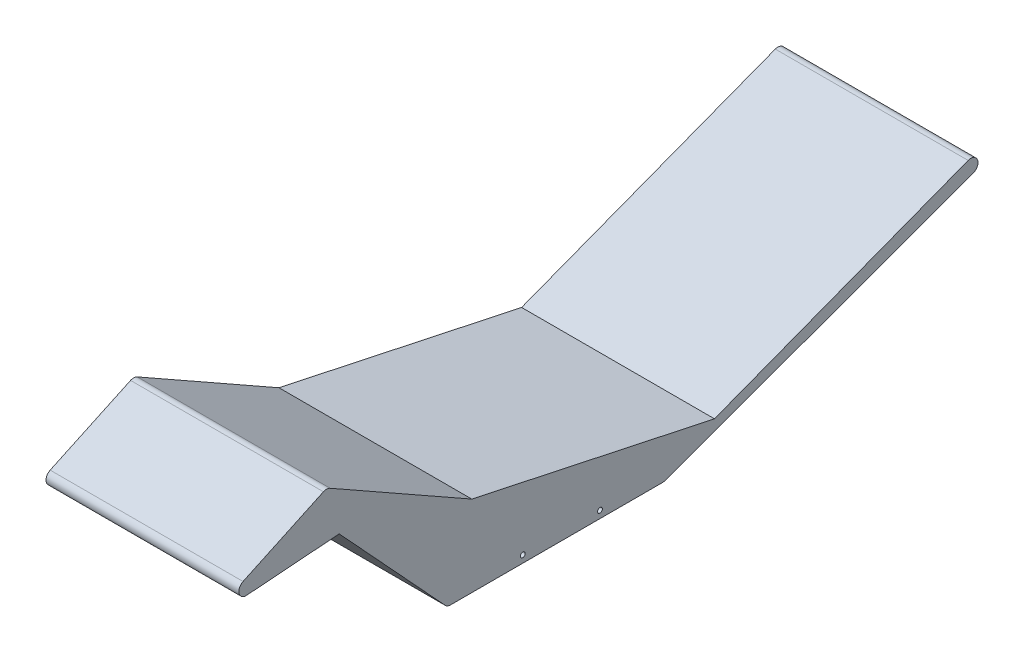
ISO-10303-21;
HEADER;
FILE_DESCRIPTION(('STEP AP214'),'2;1');
FILE_NAME('part.step','',(''),(''),'','','');
FILE_SCHEMA(('AUTOMOTIVE_DESIGN { 1 0 10303 214 1 1 1 1 }'));
ENDSEC;
DATA;
#1=APPLICATION_CONTEXT('core data for automotive mechanical design processes');
#2=APPLICATION_PROTOCOL_DEFINITION('international standard','automotive_design',2000,#1);
#3=PRODUCT_CONTEXT('',#1,'mechanical');
#4=PRODUCT('Part','Part','',(#3));
#5=PRODUCT_RELATED_PRODUCT_CATEGORY('part','',(#4));
#6=PRODUCT_DEFINITION_FORMATION('','',#4);
#7=PRODUCT_DEFINITION_CONTEXT('part definition',#1,'design');
#8=PRODUCT_DEFINITION('design','',#6,#7);
#9=PRODUCT_DEFINITION_SHAPE('','',#8);
#10=(LENGTH_UNIT() NAMED_UNIT(*) SI_UNIT(.MILLI.,.METRE.));
#11=(NAMED_UNIT(*) PLANE_ANGLE_UNIT() SI_UNIT($,.RADIAN.));
#12=(NAMED_UNIT(*) SI_UNIT($,.STERADIAN.) SOLID_ANGLE_UNIT());
#13=UNCERTAINTY_MEASURE_WITH_UNIT(LENGTH_MEASURE(1.E-05),#10,'distance_accuracy_value','');
#14=(GEOMETRIC_REPRESENTATION_CONTEXT(3) GLOBAL_UNCERTAINTY_ASSIGNED_CONTEXT((#13)) GLOBAL_UNIT_ASSIGNED_CONTEXT((#10,
#11,#12)) REPRESENTATION_CONTEXT('',''));
#15=CARTESIAN_POINT('',(0.,0.,0.));
#16=DIRECTION('',(0.,0.,1.));
#17=DIRECTION('',(1.,0.,0.));
#18=AXIS2_PLACEMENT_3D('',#15,#16,#17);
#19=CARTESIAN_POINT('',(10.,2.36110256865093,24.1434805709024));
#20=DIRECTION('',(1.,0.,0.));
#21=DIRECTION('',(0.,0.,-1.));
#22=AXIS2_PLACEMENT_3D('',#19,#20,#21);
#23=PLANE('',#22);
#24=CARTESIAN_POINT('',(10.,-3.35582982860665,9.79680062417354));
#25=DIRECTION('',(1.,0.,0.));
#26=DIRECTION('',(0.,0.,-1.));
#27=AXIS2_PLACEMENT_3D('',#24,#25,#26);
#28=CIRCLE('',#27,0.125);
#29=CARTESIAN_POINT('',(10.,-3.35582982860665,9.67180062417354));
#30=VERTEX_POINT('',#29);
#31=EDGE_CURVE('E164',#30,#30,#28,.T.);
#32=ORIENTED_EDGE('',*,*,#31,.F.);
#33=EDGE_LOOP('',(#32));
#34=FACE_BOUND('',#33,.T.);
#35=CARTESIAN_POINT('',(10.,2.36110256865093,24.1434805709024));
#36=DIRECTION('',(1.,0.,0.));
#37=DIRECTION('',(0.,0.,-1.));
#38=AXIS2_PLACEMENT_3D('',#35,#36,#37);
#39=CIRCLE('',#38,0.375);
#40=CARTESIAN_POINT('',(10.,2.70097386496634,24.3019498169437));
#41=VERTEX_POINT('',#40);
#42=CARTESIAN_POINT('',(10.,1.98715231573779,24.1154411638795));
#43=VERTEX_POINT('',#42);
#44=EDGE_CURVE('E185',#41,#43,#39,.T.);
#45=ORIENTED_EDGE('',*,*,#44,.T.);
#46=DIRECTION('',(0.,0.0747717520611336,-0.997200674435045));
#47=VECTOR('',#46,1.);
#48=CARTESIAN_POINT('',(10.,1.98715231573779,24.1154411638795));
#49=LINE('',#48,#47);
#50=CARTESIAN_POINT('',(10.,2.34689689004643,19.3176729929315));
#51=VERTEX_POINT('',#50);
#52=EDGE_CURVE('E108',#43,#51,#49,.T.);
#53=ORIENTED_EDGE('',*,*,#52,.T.);
#54=DIRECTION('',(0.,-0.735012208848401,-0.678053871638378));
#55=VECTOR('',#54,1.);
#56=CARTESIAN_POINT('',(10.,2.34689689004643,19.3176729929315));
#57=LINE('',#56,#55);
#58=CARTESIAN_POINT('',(10.,-3.60996098275747,13.8224301999138));
#59=VERTEX_POINT('',#58);
#60=EDGE_CURVE('E215',#51,#59,#57,.T.);
#61=ORIENTED_EDGE('',*,*,#60,.T.);
#62=CARTESIAN_POINT('',(10.,-3.35569078089308,13.5468006215956));
#63=DIRECTION('',(1.,0.,0.));
#64=DIRECTION('',(0.,0.,-1.));
#65=AXIS2_PLACEMENT_3D('',#62,#63,#64);
#66=CIRCLE('',#65,0.374999999999999);
#67=CARTESIAN_POINT('',(10.,-3.73069078063529,13.546814526367));
#68=VERTEX_POINT('',#67);
#69=EDGE_CURVE('E234',#59,#68,#66,.T.);
#70=ORIENTED_EDGE('',*,*,#69,.T.);
#71=DIRECTION('',(0.,-3.70793902839628E-05,-0.999999999312559));
#72=VECTOR('',#71,1.);
#73=CARTESIAN_POINT('',(10.,-3.73069078063529,13.546814526367));
#74=LINE('',#73,#72);
#75=CARTESIAN_POINT('',(10.,-3.73109865392841,2.54681453392884));
#76=VERTEX_POINT('',#75);
#77=EDGE_CURVE('E231',#68,#76,#74,.T.);
#78=ORIENTED_EDGE('',*,*,#77,.T.);
#79=CARTESIAN_POINT('',(10.,-3.3560986541862,2.54680062915748));
#80=DIRECTION('',(1.,0.,0.));
#81=DIRECTION('',(0.,0.,-1.));
#82=AXIS2_PLACEMENT_3D('',#79,#80,#81);
#83=CIRCLE('',#82,0.375);
#84=CARTESIAN_POINT('',(10.,-3.70848814245057,2.41855614170956));
#85=VERTEX_POINT('',#84);
#86=EDGE_CURVE('E233',#76,#85,#83,.T.);
#87=ORIENTED_EDGE('',*,*,#86,.T.);
#88=DIRECTION('',(0.,0.341985299861119,-0.939705302038304));
#89=VECTOR('',#88,1.);
#90=CARTESIAN_POINT('',(10.,-3.70848814245057,2.41855614170956));
#91=LINE('',#90,#89);
#92=CARTESIAN_POINT('',(10.,2.10526195518845,-13.5564339929416));
#93=VERTEX_POINT('',#92);
#94=EDGE_CURVE('E236',#85,#93,#91,.T.);
#95=ORIENTED_EDGE('',*,*,#94,.T.);
#96=CARTESIAN_POINT('',(10.,2.45765144345282,-13.4281895054937));
#97=DIRECTION('',(1.,0.,0.));
#98=DIRECTION('',(0.,0.,-1.));
#99=AXIS2_PLACEMENT_3D('',#96,#97,#98);
#100=CIRCLE('',#99,0.375);
#101=CARTESIAN_POINT('',(10.,2.80796914655646,-13.2943892555231));
#102=VERTEX_POINT('',#101);
#103=EDGE_CURVE('E242',#93,#102,#100,.T.);
#104=ORIENTED_EDGE('',*,*,#103,.T.);
#105=DIRECTION('',(0.,-0.356800666588182,0.93418054160972));
#106=VECTOR('',#105,1.);
#107=CARTESIAN_POINT('',(10.,-2.21608506413453,-0.140339605058277));
#108=LINE('',#107,#106);
#109=CARTESIAN_POINT('',(10.,-2.21608506413453,-0.140339605058277));
#110=VERTEX_POINT('',#109);
#111=EDGE_CURVE('E244',#102,#110,#108,.T.);
#112=ORIENTED_EDGE('',*,*,#111,.T.);
#113=DIRECTION('',(0.,0.208823445353652,0.977953357103819));
#114=VECTOR('',#113,1.);
#115=CARTESIAN_POINT('',(10.,0.470501467402917,12.4413717694351));
#116=LINE('',#115,#114);
#117=CARTESIAN_POINT('',(10.,0.470501467402917,12.4413717694351));
#118=VERTEX_POINT('',#117);
#119=EDGE_CURVE('E142',#110,#118,#116,.T.);
#120=ORIENTED_EDGE('',*,*,#119,.T.);
#121=DIRECTION('',(0.,0.492725898414591,0.870184571818838));
#122=VECTOR('',#121,1.);
#123=CARTESIAN_POINT('',(10.,4.63131120118912,19.789620457528));
#124=LINE('',#123,#122);
#125=CARTESIAN_POINT('',(10.,4.63131120118913,19.789620457528));
#126=VERTEX_POINT('',#125);
#127=EDGE_CURVE('E136',#118,#126,#124,.T.);
#128=ORIENTED_EDGE('',*,*,#127,.T.);
#129=CARTESIAN_POINT('',(10.,4.30499198675706,19.9743926694335));
#130=DIRECTION('',(1.,0.,0.));
#131=DIRECTION('',(0.,0.,-1.));
#132=AXIS2_PLACEMENT_3D('',#129,#130,#131);
#133=CIRCLE('',#132,0.375);
#134=CARTESIAN_POINT('',(10.,4.64486328307247,20.1328619154747));
#135=VERTEX_POINT('',#134);
#136=EDGE_CURVE('E140',#126,#135,#133,.T.);
#137=ORIENTED_EDGE('',*,*,#136,.T.);
#138=DIRECTION('',(0.,-0.422584656110028,0.906323456841082));
#139=VECTOR('',#138,1.);
#140=CARTESIAN_POINT('',(10.,2.70097386496634,24.3019498169437));
#141=LINE('',#140,#139);
#142=EDGE_CURVE('E50',#135,#41,#141,.T.);
#143=ORIENTED_EDGE('',*,*,#142,.T.);
#144=EDGE_LOOP('',(#45,#53,#61,#70,#78,#87,#95,#104,#112,#120,#128,#137,#143));
#145=FACE_BOUND('',#144,.T.);
#146=CARTESIAN_POINT('',(10.,-3.35597814616778,5.7968006269233));
#147=DIRECTION('',(1.,0.,0.));
#148=DIRECTION('',(0.,0.,-1.));
#149=AXIS2_PLACEMENT_3D('',#146,#147,#148);
#150=CIRCLE('',#149,0.125);
#151=CARTESIAN_POINT('',(10.,-3.35597814616778,5.6718006269233));
#152=VERTEX_POINT('',#151);
#153=EDGE_CURVE('E286',#152,#152,#150,.T.);
#154=ORIENTED_EDGE('',*,*,#153,.F.);
#155=EDGE_LOOP('',(#154));
#156=FACE_BOUND('',#155,.T.);
#157=ADVANCED_FACE('F33',(#34,#145,#156),#23,.T.);
#158=CARTESIAN_POINT('',(0.,2.36110256865093,24.1434805709024));
#159=DIRECTION('',(1.,0.,0.));
#160=DIRECTION('',(0.,0.,-1.));
#161=AXIS2_PLACEMENT_3D('',#158,#159,#160);
#162=PLANE('',#161);
#163=CARTESIAN_POINT('',(0.,2.36110256865093,24.1434805709024));
#164=DIRECTION('',(1.,0.,0.));
#165=DIRECTION('',(0.,0.,-1.));
#166=AXIS2_PLACEMENT_3D('',#163,#164,#165);
#167=CIRCLE('',#166,0.375);
#168=CARTESIAN_POINT('',(0.,2.70097386496634,24.3019498169437));
#169=VERTEX_POINT('',#168);
#170=CARTESIAN_POINT('',(0.,1.98715231573779,24.1154411638795));
#171=VERTEX_POINT('',#170);
#172=EDGE_CURVE('E160',#169,#171,#167,.T.);
#173=ORIENTED_EDGE('',*,*,#172,.F.);
#174=DIRECTION('',(0.,-0.422584656110028,0.906323456841082));
#175=VECTOR('',#174,1.);
#176=CARTESIAN_POINT('',(0.,2.70097386496634,24.3019498169437));
#177=LINE('',#176,#175);
#178=CARTESIAN_POINT('',(0.,4.64486328307247,20.1328619154747));
#179=VERTEX_POINT('',#178);
#180=EDGE_CURVE('E100',#179,#169,#177,.T.);
#181=ORIENTED_EDGE('',*,*,#180,.F.);
#182=CARTESIAN_POINT('',(0.,4.30499198675706,19.9743926694335));
#183=DIRECTION('',(1.,0.,0.));
#184=DIRECTION('',(0.,0.,-1.));
#185=AXIS2_PLACEMENT_3D('',#182,#183,#184);
#186=CIRCLE('',#185,0.375);
#187=CARTESIAN_POINT('',(0.,4.63131120118913,19.789620457528));
#188=VERTEX_POINT('',#187);
#189=EDGE_CURVE('E94',#188,#179,#186,.T.);
#190=ORIENTED_EDGE('',*,*,#189,.F.);
#191=DIRECTION('',(0.,0.492725898414591,0.870184571818838));
#192=VECTOR('',#191,1.);
#193=CARTESIAN_POINT('',(0.,4.63131120118912,19.789620457528));
#194=LINE('',#193,#192);
#195=CARTESIAN_POINT('',(0.,0.470501467402917,12.4413717694351));
#196=VERTEX_POINT('',#195);
#197=EDGE_CURVE('E150',#196,#188,#194,.T.);
#198=ORIENTED_EDGE('',*,*,#197,.F.);
#199=DIRECTION('',(0.,0.208823445353652,0.977953357103819));
#200=VECTOR('',#199,1.);
#201=CARTESIAN_POINT('',(0.,0.470501467402917,12.4413717694351));
#202=LINE('',#201,#200);
#203=CARTESIAN_POINT('',(0.,-2.21608506413453,-0.140339605058277));
#204=VERTEX_POINT('',#203);
#205=EDGE_CURVE('E180',#204,#196,#202,.T.);
#206=ORIENTED_EDGE('',*,*,#205,.F.);
#207=DIRECTION('',(0.,-0.356800666588182,0.93418054160972));
#208=VECTOR('',#207,1.);
#209=CARTESIAN_POINT('',(0.,-2.21608506413453,-0.140339605058277));
#210=LINE('',#209,#208);
#211=CARTESIAN_POINT('',(0.,2.80796914655646,-13.2943892555231));
#212=VERTEX_POINT('',#211);
#213=EDGE_CURVE('E178',#212,#204,#210,.T.);
#214=ORIENTED_EDGE('',*,*,#213,.F.);
#215=CARTESIAN_POINT('',(0.,2.45765144345282,-13.4281895054937));
#216=DIRECTION('',(1.,0.,0.));
#217=DIRECTION('',(0.,0.,-1.));
#218=AXIS2_PLACEMENT_3D('',#215,#216,#217);
#219=CIRCLE('',#218,0.375);
#220=CARTESIAN_POINT('',(0.,2.10526195518845,-13.5564339929416));
#221=VERTEX_POINT('',#220);
#222=EDGE_CURVE('E176',#221,#212,#219,.T.);
#223=ORIENTED_EDGE('',*,*,#222,.F.);
#224=DIRECTION('',(0.,0.341985299861119,-0.939705302038304));
#225=VECTOR('',#224,1.);
#226=CARTESIAN_POINT('',(0.,-3.70848814245057,2.41855614170956));
#227=LINE('',#226,#225);
#228=CARTESIAN_POINT('',(0.,-3.70848814245057,2.41855614170956));
#229=VERTEX_POINT('',#228);
#230=EDGE_CURVE('E174',#229,#221,#227,.T.);
#231=ORIENTED_EDGE('',*,*,#230,.F.);
#232=CARTESIAN_POINT('',(0.,-3.3560986541862,2.54680062915748));
#233=DIRECTION('',(1.,0.,0.));
#234=DIRECTION('',(0.,0.,-1.));
#235=AXIS2_PLACEMENT_3D('',#232,#233,#234);
#236=CIRCLE('',#235,0.375);
#237=CARTESIAN_POINT('',(0.,-3.73109865392841,2.54681453392884));
#238=VERTEX_POINT('',#237);
#239=EDGE_CURVE('E172',#238,#229,#236,.T.);
#240=ORIENTED_EDGE('',*,*,#239,.F.);
#241=DIRECTION('',(0.,-3.70793902839628E-05,-0.999999999312559));
#242=VECTOR('',#241,1.);
#243=CARTESIAN_POINT('',(0.,-3.73069078063529,13.546814526367));
#244=LINE('',#243,#242);
#245=CARTESIAN_POINT('',(0.,-3.73069078063529,13.546814526367));
#246=VERTEX_POINT('',#245);
#247=EDGE_CURVE('E170',#246,#238,#244,.T.);
#248=ORIENTED_EDGE('',*,*,#247,.F.);
#249=CARTESIAN_POINT('',(0.,-3.35569078089308,13.5468006215956));
#250=DIRECTION('',(1.,0.,0.));
#251=DIRECTION('',(0.,0.,-1.));
#252=AXIS2_PLACEMENT_3D('',#249,#250,#251);
#253=CIRCLE('',#252,0.374999999999999);
#254=CARTESIAN_POINT('',(0.,-3.60996098275747,13.8224301999138));
#255=VERTEX_POINT('',#254);
#256=EDGE_CURVE('E168',#255,#246,#253,.T.);
#257=ORIENTED_EDGE('',*,*,#256,.F.);
#258=DIRECTION('',(0.,-0.735012208848401,-0.678053871638378));
#259=VECTOR('',#258,1.);
#260=CARTESIAN_POINT('',(0.,2.34689689004643,19.3176729929315));
#261=LINE('',#260,#259);
#262=CARTESIAN_POINT('',(0.,2.34689689004643,19.3176729929315));
#263=VERTEX_POINT('',#262);
#264=EDGE_CURVE('E166',#263,#255,#261,.T.);
#265=ORIENTED_EDGE('',*,*,#264,.F.);
#266=DIRECTION('',(0.,0.0747717520611336,-0.997200674435045));
#267=VECTOR('',#266,1.);
#268=CARTESIAN_POINT('',(0.,1.98715231573779,24.1154411638795));
#269=LINE('',#268,#267);
#270=EDGE_CURVE('E163',#171,#263,#269,.T.);
#271=ORIENTED_EDGE('',*,*,#270,.F.);
#272=EDGE_LOOP('',(#173,#181,#190,#198,#206,#214,#223,#231,#240,#248,#257,#265,#271));
#273=FACE_BOUND('',#272,.T.);
#274=CARTESIAN_POINT('',(0.,-3.35582982860665,9.79680062417354));
#275=DIRECTION('',(1.,0.,0.));
#276=DIRECTION('',(0.,0.,-1.));
#277=AXIS2_PLACEMENT_3D('',#274,#275,#276);
#278=CIRCLE('',#277,0.125);
#279=CARTESIAN_POINT('',(0.,-3.35582982860665,9.67180062417354));
#280=VERTEX_POINT('',#279);
#281=EDGE_CURVE('E292',#280,#280,#278,.T.);
#282=ORIENTED_EDGE('',*,*,#281,.T.);
#283=EDGE_LOOP('',(#282));
#284=FACE_BOUND('',#283,.T.);
#285=CARTESIAN_POINT('',(0.,-3.35597814616778,5.7968006269233));
#286=DIRECTION('',(1.,0.,0.));
#287=DIRECTION('',(0.,0.,-1.));
#288=AXIS2_PLACEMENT_3D('',#285,#286,#287);
#289=CIRCLE('',#288,0.125);
#290=CARTESIAN_POINT('',(0.,-3.35597814616778,5.6718006269233));
#291=VERTEX_POINT('',#290);
#292=EDGE_CURVE('E289',#291,#291,#289,.T.);
#293=ORIENTED_EDGE('',*,*,#292,.T.);
#294=EDGE_LOOP('',(#293));
#295=FACE_BOUND('',#294,.T.);
#296=ADVANCED_FACE('F219',(#273,#284,#295),#162,.F.);
#297=CARTESIAN_POINT('',(10.,2.36110256865093,24.1434805709024));
#298=DIRECTION('',(-1.,0.,0.));
#299=DIRECTION('',(0.,0.,1.));
#300=AXIS2_PLACEMENT_3D('',#297,#298,#299);
#301=CYLINDRICAL_SURFACE('',#300,0.375);
#302=ORIENTED_EDGE('',*,*,#172,.T.);
#303=DIRECTION('',(-1.,0.,0.));
#304=VECTOR('',#303,1.);
#305=CARTESIAN_POINT('',(10.,1.98715231573779,24.1154411638795));
#306=LINE('',#305,#304);
#307=EDGE_CURVE('E11',#43,#171,#306,.T.);
#308=ORIENTED_EDGE('',*,*,#307,.F.);
#309=ORIENTED_EDGE('',*,*,#44,.F.);
#310=DIRECTION('',(-1.,0.,0.));
#311=VECTOR('',#310,1.);
#312=CARTESIAN_POINT('',(10.,2.70097386496634,24.3019498169437));
#313=LINE('',#312,#311);
#314=EDGE_CURVE('E156',#41,#169,#313,.T.);
#315=ORIENTED_EDGE('',*,*,#314,.T.);
#316=EDGE_LOOP('',(#302,#308,#309,#315));
#317=FACE_BOUND('',#316,.T.);
#318=ADVANCED_FACE('F35',(#317),#301,.T.);
#319=CARTESIAN_POINT('',(10.,1.98715231573779,24.1154411638795));
#320=DIRECTION('',(0.,0.997200674435045,0.0747717520611336));
#321=DIRECTION('',(0.,-0.0747717520611336,0.997200674435045));
#322=AXIS2_PLACEMENT_3D('',#319,#320,#321);
#323=PLANE('',#322);
#324=ORIENTED_EDGE('',*,*,#270,.T.);
#325=DIRECTION('',(-1.,0.,0.));
#326=VECTOR('',#325,1.);
#327=CARTESIAN_POINT('',(10.,2.34689689004643,19.3176729929315));
#328=LINE('',#327,#326);
#329=EDGE_CURVE('E42',#51,#263,#328,.T.);
#330=ORIENTED_EDGE('',*,*,#329,.F.);
#331=ORIENTED_EDGE('',*,*,#52,.F.);
#332=ORIENTED_EDGE('',*,*,#307,.T.);
#333=EDGE_LOOP('',(#324,#330,#331,#332));
#334=FACE_BOUND('',#333,.T.);
#335=ADVANCED_FACE('F395',(#334),#323,.F.);
#336=CARTESIAN_POINT('',(10.,2.34689689004643,19.3176729929315));
#337=DIRECTION('',(0.,0.678053871638378,-0.735012208848401));
#338=DIRECTION('',(0.,0.735012208848401,0.678053871638378));
#339=AXIS2_PLACEMENT_3D('',#336,#337,#338);
#340=PLANE('',#339);
#341=ORIENTED_EDGE('',*,*,#264,.T.);
#342=DIRECTION('',(-1.,0.,0.));
#343=VECTOR('',#342,1.);
#344=CARTESIAN_POINT('',(10.,-3.60996098275747,13.8224301999138));
#345=LINE('',#344,#343);
#346=EDGE_CURVE('E207',#59,#255,#345,.T.);
#347=ORIENTED_EDGE('',*,*,#346,.F.);
#348=ORIENTED_EDGE('',*,*,#60,.F.);
#349=ORIENTED_EDGE('',*,*,#329,.T.);
#350=EDGE_LOOP('',(#341,#347,#348,#349));
#351=FACE_BOUND('',#350,.T.);
#352=ADVANCED_FACE('F213',(#351),#340,.F.);
#353=CARTESIAN_POINT('',(10.,-3.35569078089308,13.5468006215956));
#354=DIRECTION('',(-1.,0.,0.));
#355=DIRECTION('',(0.,0.,1.));
#356=AXIS2_PLACEMENT_3D('',#353,#354,#355);
#357=CYLINDRICAL_SURFACE('',#356,0.374999999999999);
#358=ORIENTED_EDGE('',*,*,#256,.T.);
#359=DIRECTION('',(-1.,0.,0.));
#360=VECTOR('',#359,1.);
#361=CARTESIAN_POINT('',(10.,-3.73069078063529,13.546814526367));
#362=LINE('',#361,#360);
#363=EDGE_CURVE('E204',#68,#246,#362,.T.);
#364=ORIENTED_EDGE('',*,*,#363,.F.);
#365=ORIENTED_EDGE('',*,*,#69,.F.);
#366=ORIENTED_EDGE('',*,*,#346,.T.);
#367=EDGE_LOOP('',(#358,#364,#365,#366));
#368=FACE_BOUND('',#367,.T.);
#369=ADVANCED_FACE('F225',(#368),#357,.T.);
#370=CARTESIAN_POINT('',(10.,-3.73069078063529,13.546814526367));
#371=DIRECTION('',(0.,0.999999999312559,-3.70793902839628E-05));
#372=DIRECTION('',(0.,3.70793902839628E-05,0.999999999312559));
#373=AXIS2_PLACEMENT_3D('',#370,#371,#372);
#374=PLANE('',#373);
#375=ORIENTED_EDGE('',*,*,#247,.T.);
#376=DIRECTION('',(-1.,0.,0.));
#377=VECTOR('',#376,1.);
#378=CARTESIAN_POINT('',(10.,-3.73109865392841,2.54681453392884));
#379=LINE('',#378,#377);
#380=EDGE_CURVE('E201',#76,#238,#379,.T.);
#381=ORIENTED_EDGE('',*,*,#380,.F.);
#382=ORIENTED_EDGE('',*,*,#77,.F.);
#383=ORIENTED_EDGE('',*,*,#363,.T.);
#384=EDGE_LOOP('',(#375,#381,#382,#383));
#385=FACE_BOUND('',#384,.T.);
#386=ADVANCED_FACE('F229',(#385),#374,.F.);
#387=CARTESIAN_POINT('',(10.,-3.3560986541862,2.54680062915748));
#388=DIRECTION('',(-1.,0.,0.));
#389=DIRECTION('',(0.,0.,1.));
#390=AXIS2_PLACEMENT_3D('',#387,#388,#389);
#391=CYLINDRICAL_SURFACE('',#390,0.375);
#392=ORIENTED_EDGE('',*,*,#239,.T.);
#393=DIRECTION('',(-1.,0.,0.));
#394=VECTOR('',#393,1.);
#395=CARTESIAN_POINT('',(10.,-3.70848814245057,2.41855614170956));
#396=LINE('',#395,#394);
#397=EDGE_CURVE('E198',#85,#229,#396,.T.);
#398=ORIENTED_EDGE('',*,*,#397,.F.);
#399=ORIENTED_EDGE('',*,*,#86,.F.);
#400=ORIENTED_EDGE('',*,*,#380,.T.);
#401=EDGE_LOOP('',(#392,#398,#399,#400));
#402=FACE_BOUND('',#401,.T.);
#403=ADVANCED_FACE('F360',(#402),#391,.T.);
#404=CARTESIAN_POINT('',(10.,-3.70848814245057,2.41855614170956));
#405=DIRECTION('',(0.,0.939705302038304,0.341985299861119));
#406=DIRECTION('',(0.,-0.341985299861119,0.939705302038304));
#407=AXIS2_PLACEMENT_3D('',#404,#405,#406);
#408=PLANE('',#407);
#409=ORIENTED_EDGE('',*,*,#230,.T.);
#410=DIRECTION('',(-1.,0.,0.));
#411=VECTOR('',#410,1.);
#412=CARTESIAN_POINT('',(10.,2.10526195518845,-13.5564339929416));
#413=LINE('',#412,#411);
#414=EDGE_CURVE('E195',#93,#221,#413,.T.);
#415=ORIENTED_EDGE('',*,*,#414,.F.);
#416=ORIENTED_EDGE('',*,*,#94,.F.);
#417=ORIENTED_EDGE('',*,*,#397,.T.);
#418=EDGE_LOOP('',(#409,#415,#416,#417));
#419=FACE_BOUND('',#418,.T.);
#420=ADVANCED_FACE('F350',(#419),#408,.F.);
#421=CARTESIAN_POINT('',(10.,2.45765144345282,-13.4281895054937));
#422=DIRECTION('',(-1.,0.,0.));
#423=DIRECTION('',(0.,0.,1.));
#424=AXIS2_PLACEMENT_3D('',#421,#422,#423);
#425=CYLINDRICAL_SURFACE('',#424,0.375);
#426=ORIENTED_EDGE('',*,*,#222,.T.);
#427=DIRECTION('',(-1.,0.,0.));
#428=VECTOR('',#427,1.);
#429=CARTESIAN_POINT('',(10.,2.80796914655646,-13.2943892555231));
#430=LINE('',#429,#428);
#431=EDGE_CURVE('E192',#102,#212,#430,.T.);
#432=ORIENTED_EDGE('',*,*,#431,.F.);
#433=ORIENTED_EDGE('',*,*,#103,.F.);
#434=ORIENTED_EDGE('',*,*,#414,.T.);
#435=EDGE_LOOP('',(#426,#432,#433,#434));
#436=FACE_BOUND('',#435,.T.);
#437=ADVANCED_FACE('F341',(#436),#425,.T.);
#438=CARTESIAN_POINT('',(10.,-2.21608506413453,-0.140339605058277));
#439=DIRECTION('',(0.,-0.93418054160972,-0.356800666588182));
#440=DIRECTION('',(0.,0.356800666588182,-0.93418054160972));
#441=AXIS2_PLACEMENT_3D('',#438,#439,#440);
#442=PLANE('',#441);
#443=ORIENTED_EDGE('',*,*,#213,.T.);
#444=DIRECTION('',(-1.,0.,0.));
#445=VECTOR('',#444,1.);
#446=CARTESIAN_POINT('',(10.,-2.21608506413453,-0.140339605058277));
#447=LINE('',#446,#445);
#448=EDGE_CURVE('E189',#110,#204,#447,.T.);
#449=ORIENTED_EDGE('',*,*,#448,.F.);
#450=ORIENTED_EDGE('',*,*,#111,.F.);
#451=ORIENTED_EDGE('',*,*,#431,.T.);
#452=EDGE_LOOP('',(#443,#449,#450,#451));
#453=FACE_BOUND('',#452,.T.);
#454=ADVANCED_FACE('F250',(#453),#442,.F.);
#455=CARTESIAN_POINT('',(10.,0.470501467402917,12.4413717694351));
#456=DIRECTION('',(0.,-0.977953357103819,0.208823445353652));
#457=DIRECTION('',(0.,-0.208823445353652,-0.977953357103819));
#458=AXIS2_PLACEMENT_3D('',#455,#456,#457);
#459=PLANE('',#458);
#460=ORIENTED_EDGE('',*,*,#205,.T.);
#461=DIRECTION('',(-1.,0.,0.));
#462=VECTOR('',#461,1.);
#463=CARTESIAN_POINT('',(10.,0.470501467402917,12.4413717694351));
#464=LINE('',#463,#462);
#465=EDGE_CURVE('E151',#118,#196,#464,.T.);
#466=ORIENTED_EDGE('',*,*,#465,.F.);
#467=ORIENTED_EDGE('',*,*,#119,.F.);
#468=ORIENTED_EDGE('',*,*,#448,.T.);
#469=EDGE_LOOP('',(#460,#466,#467,#468));
#470=FACE_BOUND('',#469,.T.);
#471=ADVANCED_FACE('F254',(#470),#459,.F.);
#472=CARTESIAN_POINT('',(10.,4.63131120118912,19.789620457528));
#473=DIRECTION('',(0.,-0.870184571818838,0.492725898414591));
#474=DIRECTION('',(0.,-0.492725898414591,-0.870184571818838));
#475=AXIS2_PLACEMENT_3D('',#472,#473,#474);
#476=PLANE('',#475);
#477=ORIENTED_EDGE('',*,*,#197,.T.);
#478=DIRECTION('',(-1.,0.,0.));
#479=VECTOR('',#478,1.);
#480=CARTESIAN_POINT('',(10.,4.63131120118913,19.789620457528));
#481=LINE('',#480,#479);
#482=EDGE_CURVE('E147',#126,#188,#481,.T.);
#483=ORIENTED_EDGE('',*,*,#482,.F.);
#484=ORIENTED_EDGE('',*,*,#127,.F.);
#485=ORIENTED_EDGE('',*,*,#465,.T.);
#486=EDGE_LOOP('',(#477,#483,#484,#485));
#487=FACE_BOUND('',#486,.T.);
#488=ADVANCED_FACE('F148',(#487),#476,.F.);
#489=CARTESIAN_POINT('',(10.,4.30499198675706,19.9743926694335));
#490=DIRECTION('',(-1.,0.,0.));
#491=DIRECTION('',(0.,0.,1.));
#492=AXIS2_PLACEMENT_3D('',#489,#490,#491);
#493=CYLINDRICAL_SURFACE('',#492,0.375);
#494=ORIENTED_EDGE('',*,*,#189,.T.);
#495=DIRECTION('',(-1.,0.,0.));
#496=VECTOR('',#495,1.);
#497=CARTESIAN_POINT('',(10.,4.64486328307247,20.1328619154747));
#498=LINE('',#497,#496);
#499=EDGE_CURVE('E152',#135,#179,#498,.T.);
#500=ORIENTED_EDGE('',*,*,#499,.F.);
#501=ORIENTED_EDGE('',*,*,#136,.F.);
#502=ORIENTED_EDGE('',*,*,#482,.T.);
#503=EDGE_LOOP('',(#494,#500,#501,#502));
#504=FACE_BOUND('',#503,.T.);
#505=ADVANCED_FACE('F154',(#504),#493,.T.);
#506=CARTESIAN_POINT('',(10.,2.70097386496634,24.3019498169437));
#507=DIRECTION('',(0.,-0.906323456841082,-0.422584656110028));
#508=DIRECTION('',(0.,0.422584656110028,-0.906323456841082));
#509=AXIS2_PLACEMENT_3D('',#506,#507,#508);
#510=PLANE('',#509);
#511=ORIENTED_EDGE('',*,*,#180,.T.);
#512=ORIENTED_EDGE('',*,*,#314,.F.);
#513=ORIENTED_EDGE('',*,*,#142,.F.);
#514=ORIENTED_EDGE('',*,*,#499,.T.);
#515=EDGE_LOOP('',(#511,#512,#513,#514));
#516=FACE_BOUND('',#515,.T.);
#517=ADVANCED_FACE('F258',(#516),#510,.F.);
#518=CARTESIAN_POINT('',(10.,-3.35582982860665,9.79680062417354));
#519=DIRECTION('',(-1.,0.,0.));
#520=DIRECTION('',(0.,0.,1.));
#521=AXIS2_PLACEMENT_3D('',#518,#519,#520);
#522=CYLINDRICAL_SURFACE('',#521,0.125);
#523=ORIENTED_EDGE('',*,*,#31,.T.);
#524=EDGE_LOOP('',(#523));
#525=FACE_BOUND('',#524,.T.);
#526=ORIENTED_EDGE('',*,*,#281,.F.);
#527=EDGE_LOOP('',(#526));
#528=FACE_BOUND('',#527,.T.);
#529=ADVANCED_FACE('F260',(#525,#528),#522,.F.);
#530=CARTESIAN_POINT('',(10.,-3.35597814616778,5.7968006269233));
#531=DIRECTION('',(-1.,0.,0.));
#532=DIRECTION('',(0.,0.,1.));
#533=AXIS2_PLACEMENT_3D('',#530,#531,#532);
#534=CYLINDRICAL_SURFACE('',#533,0.125);
#535=ORIENTED_EDGE('',*,*,#153,.T.);
#536=EDGE_LOOP('',(#535));
#537=FACE_BOUND('',#536,.T.);
#538=ORIENTED_EDGE('',*,*,#292,.F.);
#539=EDGE_LOOP('',(#538));
#540=FACE_BOUND('',#539,.T.);
#541=ADVANCED_FACE('F266',(#537,#540),#534,.F.);
#542=CLOSED_SHELL('',(#157,#296,#318,#335,#352,#369,#386,#403,#420,#437,#454,#471,#488,#505,
#517,#529,#541));
#543=MANIFOLD_SOLID_BREP('B2',#542);
#544=ADVANCED_BREP_SHAPE_REPRESENTATION('',(#18,#543),#14);
#545=SHAPE_DEFINITION_REPRESENTATION(#9,#544);
ENDSEC;
END-ISO-10303-21;
